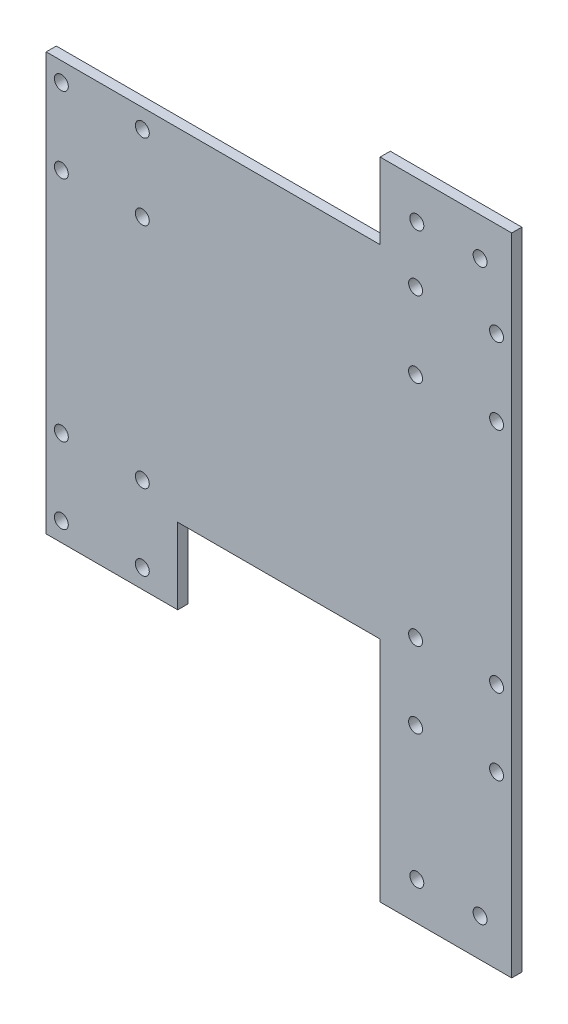
ISO-10303-21;
HEADER;
FILE_DESCRIPTION(('STEP AP214'),'2;1');
FILE_NAME('part.step','',(''),(''),'','','');
FILE_SCHEMA(('AUTOMOTIVE_DESIGN { 1 0 10303 214 1 1 1 1 }'));
ENDSEC;
DATA;
#1=APPLICATION_CONTEXT('core data for automotive mechanical design processes');
#2=APPLICATION_PROTOCOL_DEFINITION('international standard','automotive_design',2000,#1);
#3=PRODUCT_CONTEXT('',#1,'mechanical');
#4=PRODUCT('Part','Part','',(#3));
#5=PRODUCT_RELATED_PRODUCT_CATEGORY('part','',(#4));
#6=PRODUCT_DEFINITION_FORMATION('','',#4);
#7=PRODUCT_DEFINITION_CONTEXT('part definition',#1,'design');
#8=PRODUCT_DEFINITION('design','',#6,#7);
#9=PRODUCT_DEFINITION_SHAPE('','',#8);
#10=(LENGTH_UNIT() NAMED_UNIT(*) SI_UNIT(.MILLI.,.METRE.));
#11=(NAMED_UNIT(*) PLANE_ANGLE_UNIT() SI_UNIT($,.RADIAN.));
#12=(NAMED_UNIT(*) SI_UNIT($,.STERADIAN.) SOLID_ANGLE_UNIT());
#13=UNCERTAINTY_MEASURE_WITH_UNIT(LENGTH_MEASURE(1.E-05),#10,'distance_accuracy_value','');
#14=(GEOMETRIC_REPRESENTATION_CONTEXT(3) GLOBAL_UNCERTAINTY_ASSIGNED_CONTEXT((#13)) GLOBAL_UNIT_ASSIGNED_CONTEXT((#10,
#11,#12)) REPRESENTATION_CONTEXT('',''));
#15=CARTESIAN_POINT('',(0.,0.,0.));
#16=DIRECTION('',(0.,0.,1.));
#17=DIRECTION('',(1.,0.,0.));
#18=AXIS2_PLACEMENT_3D('',#15,#16,#17);
#19=CARTESIAN_POINT('',(0.,0.,4.));
#20=DIRECTION('',(0.,0.,-1.));
#21=DIRECTION('',(-1.,0.,0.));
#22=AXIS2_PLACEMENT_3D('',#19,#20,#21);
#23=PLANE('',#22);
#24=CARTESIAN_POINT('',(124.5,-67.5,4.));
#25=DIRECTION('',(0.,0.,1.));
#26=DIRECTION('',(1.,0.,0.));
#27=AXIS2_PLACEMENT_3D('',#24,#25,#26);
#28=CIRCLE('',#27,2.75);
#29=CARTESIAN_POINT('',(127.25,-67.5,4.));
#30=VERTEX_POINT('',#29);
#31=EDGE_CURVE('E337',#30,#30,#28,.T.);
#32=ORIENTED_EDGE('',*,*,#31,.F.);
#33=EDGE_LOOP('',(#32));
#34=FACE_BOUND('',#33,.T.);
#35=CARTESIAN_POINT('',(124.5,157.5,4.));
#36=DIRECTION('',(0.,0.,1.));
#37=DIRECTION('',(1.,0.,0.));
#38=AXIS2_PLACEMENT_3D('',#35,#36,#37);
#39=CIRCLE('',#38,2.75);
#40=CARTESIAN_POINT('',(127.25,157.5,4.));
#41=VERTEX_POINT('',#40);
#42=EDGE_CURVE('E329',#41,#41,#39,.T.);
#43=ORIENTED_EDGE('',*,*,#42,.F.);
#44=EDGE_LOOP('',(#43));
#45=FACE_BOUND('',#44,.T.);
#46=CARTESIAN_POINT('',(149.5,157.5,4.));
#47=DIRECTION('',(0.,0.,1.));
#48=DIRECTION('',(1.,0.,0.));
#49=AXIS2_PLACEMENT_3D('',#46,#47,#48);
#50=CIRCLE('',#49,2.75);
#51=CARTESIAN_POINT('',(152.25,157.5,4.));
#52=VERTEX_POINT('',#51);
#53=EDGE_CURVE('E321',#52,#52,#50,.T.);
#54=ORIENTED_EDGE('',*,*,#53,.F.);
#55=EDGE_LOOP('',(#54));
#56=FACE_BOUND('',#55,.T.);
#57=CARTESIAN_POINT('',(16.,-15.,4.));
#58=DIRECTION('',(0.,0.,-1.));
#59=DIRECTION('',(-1.,0.,0.));
#60=AXIS2_PLACEMENT_3D('',#57,#58,#59);
#61=CIRCLE('',#60,2.75);
#62=CARTESIAN_POINT('',(13.25,-15.,4.));
#63=VERTEX_POINT('',#62);
#64=EDGE_CURVE('E220',#63,#63,#61,.T.);
#65=ORIENTED_EDGE('',*,*,#64,.T.);
#66=EDGE_LOOP('',(#65));
#67=FACE_BOUND('',#66,.T.);
#68=CARTESIAN_POINT('',(16.,15.,4.));
#69=DIRECTION('',(0.,0.,-1.));
#70=DIRECTION('',(-1.,0.,0.));
#71=AXIS2_PLACEMENT_3D('',#68,#69,#70);
#72=CIRCLE('',#71,2.75);
#73=CARTESIAN_POINT('',(13.25,15.,4.));
#74=VERTEX_POINT('',#73);
#75=EDGE_CURVE('E226',#74,#74,#72,.T.);
#76=ORIENTED_EDGE('',*,*,#75,.T.);
#77=EDGE_LOOP('',(#76));
#78=FACE_BOUND('',#77,.T.);
#79=CARTESIAN_POINT('',(-16.,15.,4.));
#80=DIRECTION('',(0.,0.,-1.));
#81=DIRECTION('',(-1.,0.,0.));
#82=AXIS2_PLACEMENT_3D('',#79,#80,#81);
#83=CIRCLE('',#82,2.75);
#84=CARTESIAN_POINT('',(-18.75,15.,4.));
#85=VERTEX_POINT('',#84);
#86=EDGE_CURVE('E232',#85,#85,#83,.T.);
#87=ORIENTED_EDGE('',*,*,#86,.T.);
#88=EDGE_LOOP('',(#87));
#89=FACE_BOUND('',#88,.T.);
#90=CARTESIAN_POINT('',(-16.,-15.,4.));
#91=DIRECTION('',(0.,0.,-1.));
#92=DIRECTION('',(-1.,0.,0.));
#93=AXIS2_PLACEMENT_3D('',#90,#91,#92);
#94=CIRCLE('',#93,2.75);
#95=CARTESIAN_POINT('',(-18.75,-15.,4.));
#96=VERTEX_POINT('',#95);
#97=EDGE_CURVE('E238',#96,#96,#94,.T.);
#98=ORIENTED_EDGE('',*,*,#97,.T.);
#99=EDGE_LOOP('',(#98));
#100=FACE_BOUND('',#99,.T.);
#101=CARTESIAN_POINT('',(-16.,105.,4.));
#102=DIRECTION('',(0.,0.,-1.));
#103=DIRECTION('',(-1.,0.,0.));
#104=AXIS2_PLACEMENT_3D('',#101,#102,#103);
#105=CIRCLE('',#104,2.75);
#106=CARTESIAN_POINT('',(-18.75,105.,4.));
#107=VERTEX_POINT('',#106);
#108=EDGE_CURVE('E244',#107,#107,#105,.T.);
#109=ORIENTED_EDGE('',*,*,#108,.T.);
#110=EDGE_LOOP('',(#109));
#111=FACE_BOUND('',#110,.T.);
#112=CARTESIAN_POINT('',(16.,105.,4.));
#113=DIRECTION('',(0.,0.,-1.));
#114=DIRECTION('',(-1.,0.,0.));
#115=AXIS2_PLACEMENT_3D('',#112,#113,#114);
#116=CIRCLE('',#115,2.75);
#117=CARTESIAN_POINT('',(13.25,105.,4.));
#118=VERTEX_POINT('',#117);
#119=EDGE_CURVE('E250',#118,#118,#116,.T.);
#120=ORIENTED_EDGE('',*,*,#119,.T.);
#121=EDGE_LOOP('',(#120));
#122=FACE_BOUND('',#121,.T.);
#123=CARTESIAN_POINT('',(16.,135.,4.));
#124=DIRECTION('',(0.,0.,-1.));
#125=DIRECTION('',(-1.,0.,0.));
#126=AXIS2_PLACEMENT_3D('',#123,#124,#125);
#127=CIRCLE('',#126,2.75);
#128=CARTESIAN_POINT('',(13.25,135.,4.));
#129=VERTEX_POINT('',#128);
#130=EDGE_CURVE('E256',#129,#129,#127,.T.);
#131=ORIENTED_EDGE('',*,*,#130,.T.);
#132=EDGE_LOOP('',(#131));
#133=FACE_BOUND('',#132,.T.);
#134=CARTESIAN_POINT('',(-16.,135.,4.));
#135=DIRECTION('',(0.,0.,-1.));
#136=DIRECTION('',(-1.,0.,0.));
#137=AXIS2_PLACEMENT_3D('',#134,#135,#136);
#138=CIRCLE('',#137,2.75);
#139=CARTESIAN_POINT('',(-18.75,135.,4.));
#140=VERTEX_POINT('',#139);
#141=EDGE_CURVE('E262',#140,#140,#138,.T.);
#142=ORIENTED_EDGE('',*,*,#141,.T.);
#143=EDGE_LOOP('',(#142));
#144=FACE_BOUND('',#143,.T.);
#145=CARTESIAN_POINT('',(124.,135.,4.));
#146=DIRECTION('',(0.,0.,-1.));
#147=DIRECTION('',(-1.,0.,0.));
#148=AXIS2_PLACEMENT_3D('',#145,#146,#147);
#149=CIRCLE('',#148,2.75);
#150=CARTESIAN_POINT('',(121.25,135.,4.));
#151=VERTEX_POINT('',#150);
#152=EDGE_CURVE('E268',#151,#151,#149,.T.);
#153=ORIENTED_EDGE('',*,*,#152,.T.);
#154=EDGE_LOOP('',(#153));
#155=FACE_BOUND('',#154,.T.);
#156=CARTESIAN_POINT('',(124.,105.,4.));
#157=DIRECTION('',(0.,0.,-1.));
#158=DIRECTION('',(-1.,0.,0.));
#159=AXIS2_PLACEMENT_3D('',#156,#157,#158);
#160=CIRCLE('',#159,2.75);
#161=CARTESIAN_POINT('',(121.25,105.,4.));
#162=VERTEX_POINT('',#161);
#163=EDGE_CURVE('E274',#162,#162,#160,.T.);
#164=ORIENTED_EDGE('',*,*,#163,.T.);
#165=EDGE_LOOP('',(#164));
#166=FACE_BOUND('',#165,.T.);
#167=CARTESIAN_POINT('',(156.,105.,4.));
#168=DIRECTION('',(0.,0.,-1.));
#169=DIRECTION('',(-1.,0.,0.));
#170=AXIS2_PLACEMENT_3D('',#167,#168,#169);
#171=CIRCLE('',#170,2.75);
#172=CARTESIAN_POINT('',(153.25,105.,4.));
#173=VERTEX_POINT('',#172);
#174=EDGE_CURVE('E280',#173,#173,#171,.T.);
#175=ORIENTED_EDGE('',*,*,#174,.T.);
#176=EDGE_LOOP('',(#175));
#177=FACE_BOUND('',#176,.T.);
#178=CARTESIAN_POINT('',(156.,135.,4.));
#179=DIRECTION('',(0.,0.,-1.));
#180=DIRECTION('',(-1.,0.,0.));
#181=AXIS2_PLACEMENT_3D('',#178,#179,#180);
#182=CIRCLE('',#181,2.75);
#183=CARTESIAN_POINT('',(153.25,135.,4.));
#184=VERTEX_POINT('',#183);
#185=EDGE_CURVE('E286',#184,#184,#182,.T.);
#186=ORIENTED_EDGE('',*,*,#185,.T.);
#187=EDGE_LOOP('',(#186));
#188=FACE_BOUND('',#187,.T.);
#189=CARTESIAN_POINT('',(156.,15.,4.));
#190=DIRECTION('',(0.,0.,-1.));
#191=DIRECTION('',(-1.,0.,0.));
#192=AXIS2_PLACEMENT_3D('',#189,#190,#191);
#193=CIRCLE('',#192,2.75);
#194=CARTESIAN_POINT('',(153.25,15.,4.));
#195=VERTEX_POINT('',#194);
#196=EDGE_CURVE('E292',#195,#195,#193,.T.);
#197=ORIENTED_EDGE('',*,*,#196,.T.);
#198=EDGE_LOOP('',(#197));
#199=FACE_BOUND('',#198,.T.);
#200=CARTESIAN_POINT('',(124.,15.,4.));
#201=DIRECTION('',(0.,0.,-1.));
#202=DIRECTION('',(-1.,0.,0.));
#203=AXIS2_PLACEMENT_3D('',#200,#201,#202);
#204=CIRCLE('',#203,2.75);
#205=CARTESIAN_POINT('',(121.25,15.,4.));
#206=VERTEX_POINT('',#205);
#207=EDGE_CURVE('E298',#206,#206,#204,.T.);
#208=ORIENTED_EDGE('',*,*,#207,.T.);
#209=EDGE_LOOP('',(#208));
#210=FACE_BOUND('',#209,.T.);
#211=CARTESIAN_POINT('',(124.,-15.,4.));
#212=DIRECTION('',(0.,0.,-1.));
#213=DIRECTION('',(-1.,0.,0.));
#214=AXIS2_PLACEMENT_3D('',#211,#212,#213);
#215=CIRCLE('',#214,2.75);
#216=CARTESIAN_POINT('',(121.25,-15.,4.));
#217=VERTEX_POINT('',#216);
#218=EDGE_CURVE('E304',#217,#217,#215,.T.);
#219=ORIENTED_EDGE('',*,*,#218,.T.);
#220=EDGE_LOOP('',(#219));
#221=FACE_BOUND('',#220,.T.);
#222=CARTESIAN_POINT('',(156.,-15.,4.));
#223=DIRECTION('',(0.,0.,-1.));
#224=DIRECTION('',(-1.,0.,0.));
#225=AXIS2_PLACEMENT_3D('',#222,#223,#224);
#226=CIRCLE('',#225,2.75);
#227=CARTESIAN_POINT('',(153.25,-15.,4.));
#228=VERTEX_POINT('',#227);
#229=EDGE_CURVE('E164',#228,#228,#226,.T.);
#230=ORIENTED_EDGE('',*,*,#229,.T.);
#231=EDGE_LOOP('',(#230));
#232=FACE_BOUND('',#231,.T.);
#233=DIRECTION('',(1.,0.,0.));
#234=VECTOR('',#233,1.);
#235=CARTESIAN_POINT('',(-22.,-22.5,4.));
#236=LINE('',#235,#234);
#237=CARTESIAN_POINT('',(-22.,-22.5,4.));
#238=VERTEX_POINT('',#237);
#239=CARTESIAN_POINT('',(30.,-22.5,4.));
#240=VERTEX_POINT('',#239);
#241=EDGE_CURVE('E314',#238,#240,#236,.T.);
#242=ORIENTED_EDGE('',*,*,#241,.T.);
#243=DIRECTION('',(0.,-1.,0.));
#244=VECTOR('',#243,1.);
#245=CARTESIAN_POINT('',(30.,-22.5,4.));
#246=LINE('',#245,#244);
#247=CARTESIAN_POINT('',(30.,7.49999999999999,4.));
#248=VERTEX_POINT('',#247);
#249=EDGE_CURVE('E206',#248,#240,#246,.T.);
#250=ORIENTED_EDGE('',*,*,#249,.F.);
#251=DIRECTION('',(-1.,0.,0.));
#252=VECTOR('',#251,1.);
#253=CARTESIAN_POINT('',(30.,7.49999999999999,4.));
#254=LINE('',#253,#252);
#255=CARTESIAN_POINT('',(110.,7.49999999999999,4.));
#256=VERTEX_POINT('',#255);
#257=EDGE_CURVE('E210',#256,#248,#254,.T.);
#258=ORIENTED_EDGE('',*,*,#257,.F.);
#259=DIRECTION('',(0.,1.,0.));
#260=VECTOR('',#259,1.);
#261=CARTESIAN_POINT('',(110.,-22.5,4.));
#262=LINE('',#261,#260);
#263=CARTESIAN_POINT('',(110.,-82.5,4.));
#264=VERTEX_POINT('',#263);
#265=EDGE_CURVE('E192',#264,#256,#262,.T.);
#266=ORIENTED_EDGE('',*,*,#265,.F.);
#267=DIRECTION('',(1.,0.,0.));
#268=VECTOR('',#267,1.);
#269=CARTESIAN_POINT('',(162.,-82.5,4.));
#270=LINE('',#269,#268);
#271=CARTESIAN_POINT('',(162.,-82.5,4.));
#272=VERTEX_POINT('',#271);
#273=EDGE_CURVE('E195',#264,#272,#270,.T.);
#274=ORIENTED_EDGE('',*,*,#273,.T.);
#275=DIRECTION('',(0.,1.,0.));
#276=VECTOR('',#275,1.);
#277=CARTESIAN_POINT('',(162.,-22.5,4.));
#278=LINE('',#277,#276);
#279=CARTESIAN_POINT('',(162.,172.5,4.));
#280=VERTEX_POINT('',#279);
#281=EDGE_CURVE('E154',#272,#280,#278,.T.);
#282=ORIENTED_EDGE('',*,*,#281,.T.);
#283=DIRECTION('',(-1.,0.,0.));
#284=VECTOR('',#283,1.);
#285=CARTESIAN_POINT('',(162.,172.5,4.));
#286=LINE('',#285,#284);
#287=CARTESIAN_POINT('',(110.,172.5,4.));
#288=VERTEX_POINT('',#287);
#289=EDGE_CURVE('E138',#280,#288,#286,.T.);
#290=ORIENTED_EDGE('',*,*,#289,.T.);
#291=DIRECTION('',(0.,-1.,0.));
#292=VECTOR('',#291,1.);
#293=CARTESIAN_POINT('',(110.,142.5,4.));
#294=LINE('',#293,#292);
#295=CARTESIAN_POINT('',(110.,142.5,4.));
#296=VERTEX_POINT('',#295);
#297=EDGE_CURVE('E129',#288,#296,#294,.T.);
#298=ORIENTED_EDGE('',*,*,#297,.T.);
#299=DIRECTION('',(-1.,0.,0.));
#300=VECTOR('',#299,1.);
#301=CARTESIAN_POINT('',(-22.,142.5,4.));
#302=LINE('',#301,#300);
#303=CARTESIAN_POINT('',(-22.,142.5,4.));
#304=VERTEX_POINT('',#303);
#305=EDGE_CURVE('E147',#296,#304,#302,.T.);
#306=ORIENTED_EDGE('',*,*,#305,.T.);
#307=DIRECTION('',(0.,-1.,0.));
#308=VECTOR('',#307,1.);
#309=CARTESIAN_POINT('',(-22.,-22.5,4.));
#310=LINE('',#309,#308);
#311=EDGE_CURVE('E312',#304,#238,#310,.T.);
#312=ORIENTED_EDGE('',*,*,#311,.T.);
#313=EDGE_LOOP('',(#242,#250,#258,#266,#274,#282,#290,#298,#306,#312));
#314=FACE_BOUND('',#313,.T.);
#315=CARTESIAN_POINT('',(149.5,-67.5,4.));
#316=DIRECTION('',(0.,0.,1.));
#317=DIRECTION('',(1.,0.,0.));
#318=AXIS2_PLACEMENT_3D('',#315,#316,#317);
#319=CIRCLE('',#318,2.75);
#320=CARTESIAN_POINT('',(152.25,-67.5,4.));
#321=VERTEX_POINT('',#320);
#322=EDGE_CURVE('E343',#321,#321,#319,.T.);
#323=ORIENTED_EDGE('',*,*,#322,.F.);
#324=EDGE_LOOP('',(#323));
#325=FACE_BOUND('',#324,.T.);
#326=ADVANCED_FACE('F35',(#34,#45,#56,#67,#78,#89,#100,#111,#122,#133,#144,#155,#166,#177,#188,
#199,#210,#221,#232,#314,#325),#23,.F.);
#327=CARTESIAN_POINT('',(-22.,142.5,4.));
#328=DIRECTION('',(0.,-1.,0.));
#329=DIRECTION('',(0.,0.,-1.));
#330=AXIS2_PLACEMENT_3D('',#327,#328,#329);
#331=PLANE('',#330);
#332=DIRECTION('',(0.,0.,1.));
#333=VECTOR('',#332,1.);
#334=CARTESIAN_POINT('',(110.,142.5,-79.3977329651168));
#335=LINE('',#334,#333);
#336=CARTESIAN_POINT('',(110.,142.5,0.));
#337=VERTEX_POINT('',#336);
#338=EDGE_CURVE('E52',#337,#296,#335,.T.);
#339=ORIENTED_EDGE('',*,*,#338,.F.);
#340=DIRECTION('',(-1.,0.,0.));
#341=VECTOR('',#340,1.);
#342=CARTESIAN_POINT('',(-22.,142.5,0.));
#343=LINE('',#342,#341);
#344=CARTESIAN_POINT('',(-22.,142.5,0.));
#345=VERTEX_POINT('',#344);
#346=EDGE_CURVE('E122',#337,#345,#343,.T.);
#347=ORIENTED_EDGE('',*,*,#346,.T.);
#348=DIRECTION('',(0.,0.,-1.));
#349=VECTOR('',#348,1.);
#350=CARTESIAN_POINT('',(-22.,142.5,4.));
#351=LINE('',#350,#349);
#352=EDGE_CURVE('E153',#304,#345,#351,.T.);
#353=ORIENTED_EDGE('',*,*,#352,.F.);
#354=ORIENTED_EDGE('',*,*,#305,.F.);
#355=EDGE_LOOP('',(#339,#347,#353,#354));
#356=FACE_BOUND('',#355,.T.);
#357=ADVANCED_FACE('F349',(#356),#331,.F.);
#358=CARTESIAN_POINT('',(-22.,-22.5,4.));
#359=DIRECTION('',(0.,1.,0.));
#360=DIRECTION('',(0.,0.,1.));
#361=AXIS2_PLACEMENT_3D('',#358,#359,#360);
#362=PLANE('',#361);
#363=DIRECTION('',(1.,0.,0.));
#364=VECTOR('',#363,1.);
#365=CARTESIAN_POINT('',(-22.,-22.5,0.));
#366=LINE('',#365,#364);
#367=CARTESIAN_POINT('',(-22.,-22.5,0.));
#368=VERTEX_POINT('',#367);
#369=CARTESIAN_POINT('',(30.,-22.5,0.));
#370=VERTEX_POINT('',#369);
#371=EDGE_CURVE('E163',#368,#370,#366,.T.);
#372=ORIENTED_EDGE('',*,*,#371,.T.);
#373=DIRECTION('',(0.,0.,1.));
#374=VECTOR('',#373,1.);
#375=CARTESIAN_POINT('',(30.,-22.5,-6.));
#376=LINE('',#375,#374);
#377=EDGE_CURVE('E212',#370,#240,#376,.T.);
#378=ORIENTED_EDGE('',*,*,#377,.T.);
#379=ORIENTED_EDGE('',*,*,#241,.F.);
#380=DIRECTION('',(0.,0.,-1.));
#381=VECTOR('',#380,1.);
#382=CARTESIAN_POINT('',(-22.,-22.5,4.));
#383=LINE('',#382,#381);
#384=EDGE_CURVE('E172',#238,#368,#383,.T.);
#385=ORIENTED_EDGE('',*,*,#384,.T.);
#386=EDGE_LOOP('',(#372,#378,#379,#385));
#387=FACE_BOUND('',#386,.T.);
#388=ADVANCED_FACE('F355',(#387),#362,.F.);
#389=CARTESIAN_POINT('',(-22.,-22.5,4.));
#390=DIRECTION('',(1.,0.,0.));
#391=DIRECTION('',(0.,1.,0.));
#392=AXIS2_PLACEMENT_3D('',#389,#390,#391);
#393=PLANE('',#392);
#394=DIRECTION('',(0.,-1.,0.));
#395=VECTOR('',#394,1.);
#396=CARTESIAN_POINT('',(-22.,-22.5,0.));
#397=LINE('',#396,#395);
#398=EDGE_CURVE('E160',#345,#368,#397,.T.);
#399=ORIENTED_EDGE('',*,*,#398,.T.);
#400=ORIENTED_EDGE('',*,*,#384,.F.);
#401=ORIENTED_EDGE('',*,*,#311,.F.);
#402=ORIENTED_EDGE('',*,*,#352,.T.);
#403=EDGE_LOOP('',(#399,#400,#401,#402));
#404=FACE_BOUND('',#403,.T.);
#405=ADVANCED_FACE('F37',(#404),#393,.F.);
#406=CARTESIAN_POINT('',(162.,-22.5,4.));
#407=DIRECTION('',(-1.,0.,0.));
#408=DIRECTION('',(0.,0.,1.));
#409=AXIS2_PLACEMENT_3D('',#406,#407,#408);
#410=PLANE('',#409);
#411=DIRECTION('',(0.,1.,0.));
#412=VECTOR('',#411,1.);
#413=CARTESIAN_POINT('',(162.,-22.5,0.));
#414=LINE('',#413,#412);
#415=CARTESIAN_POINT('',(162.,-82.5,0.));
#416=VERTEX_POINT('',#415);
#417=CARTESIAN_POINT('',(162.,172.5,0.));
#418=VERTEX_POINT('',#417);
#419=EDGE_CURVE('E167',#416,#418,#414,.T.);
#420=ORIENTED_EDGE('',*,*,#419,.T.);
#421=DIRECTION('',(0.,0.,1.));
#422=VECTOR('',#421,1.);
#423=CARTESIAN_POINT('',(162.,172.5,-79.3977329651168));
#424=LINE('',#423,#422);
#425=EDGE_CURVE('E136',#418,#280,#424,.T.);
#426=ORIENTED_EDGE('',*,*,#425,.T.);
#427=ORIENTED_EDGE('',*,*,#281,.F.);
#428=DIRECTION('',(0.,0.,1.));
#429=VECTOR('',#428,1.);
#430=CARTESIAN_POINT('',(162.,-82.5,-79.3977329651168));
#431=LINE('',#430,#429);
#432=EDGE_CURVE('E201',#416,#272,#431,.T.);
#433=ORIENTED_EDGE('',*,*,#432,.F.);
#434=EDGE_LOOP('',(#420,#426,#427,#433));
#435=FACE_BOUND('',#434,.T.);
#436=ADVANCED_FACE('F319',(#435),#410,.F.);
#437=CARTESIAN_POINT('',(0.,0.,0.));
#438=DIRECTION('',(0.,0.,-1.));
#439=DIRECTION('',(-1.,0.,0.));
#440=AXIS2_PLACEMENT_3D('',#437,#438,#439);
#441=PLANE('',#440);
#442=CARTESIAN_POINT('',(149.5,-67.5,0.));
#443=DIRECTION('',(0.,0.,-1.));
#444=DIRECTION('',(-1.,0.,0.));
#445=AXIS2_PLACEMENT_3D('',#442,#443,#444);
#446=CIRCLE('',#445,2.75);
#447=CARTESIAN_POINT('',(146.75,-67.5,0.));
#448=VERTEX_POINT('',#447);
#449=EDGE_CURVE('E340',#448,#448,#446,.T.);
#450=ORIENTED_EDGE('',*,*,#449,.F.);
#451=EDGE_LOOP('',(#450));
#452=FACE_BOUND('',#451,.T.);
#453=CARTESIAN_POINT('',(124.5,-67.5,0.));
#454=DIRECTION('',(0.,0.,-1.));
#455=DIRECTION('',(-1.,0.,0.));
#456=AXIS2_PLACEMENT_3D('',#453,#454,#455);
#457=CIRCLE('',#456,2.75);
#458=CARTESIAN_POINT('',(121.75,-67.5,0.));
#459=VERTEX_POINT('',#458);
#460=EDGE_CURVE('E334',#459,#459,#457,.T.);
#461=ORIENTED_EDGE('',*,*,#460,.F.);
#462=EDGE_LOOP('',(#461));
#463=FACE_BOUND('',#462,.T.);
#464=CARTESIAN_POINT('',(124.5,157.5,0.));
#465=DIRECTION('',(0.,0.,-1.));
#466=DIRECTION('',(-1.,0.,0.));
#467=AXIS2_PLACEMENT_3D('',#464,#465,#466);
#468=CIRCLE('',#467,2.75);
#469=CARTESIAN_POINT('',(121.75,157.5,0.));
#470=VERTEX_POINT('',#469);
#471=EDGE_CURVE('E325',#470,#470,#468,.T.);
#472=ORIENTED_EDGE('',*,*,#471,.F.);
#473=EDGE_LOOP('',(#472));
#474=FACE_BOUND('',#473,.T.);
#475=CARTESIAN_POINT('',(149.5,157.5,0.));
#476=DIRECTION('',(0.,0.,-1.));
#477=DIRECTION('',(-1.,0.,0.));
#478=AXIS2_PLACEMENT_3D('',#475,#476,#477);
#479=CIRCLE('',#478,2.75);
#480=CARTESIAN_POINT('',(146.75,157.5,0.));
#481=VERTEX_POINT('',#480);
#482=EDGE_CURVE('E39',#481,#481,#479,.T.);
#483=ORIENTED_EDGE('',*,*,#482,.F.);
#484=EDGE_LOOP('',(#483));
#485=FACE_BOUND('',#484,.T.);
#486=DIRECTION('',(0.,1.,0.));
#487=VECTOR('',#486,1.);
#488=CARTESIAN_POINT('',(30.,0.,0.));
#489=LINE('',#488,#487);
#490=CARTESIAN_POINT('',(30.,7.49999999999999,0.));
#491=VERTEX_POINT('',#490);
#492=EDGE_CURVE('E11',#370,#491,#489,.T.);
#493=ORIENTED_EDGE('',*,*,#492,.F.);
#494=ORIENTED_EDGE('',*,*,#371,.F.);
#495=ORIENTED_EDGE('',*,*,#398,.F.);
#496=ORIENTED_EDGE('',*,*,#346,.F.);
#497=DIRECTION('',(0.,-1.,0.));
#498=VECTOR('',#497,1.);
#499=CARTESIAN_POINT('',(110.,142.5,0.));
#500=LINE('',#499,#498);
#501=CARTESIAN_POINT('',(110.,172.5,0.));
#502=VERTEX_POINT('',#501);
#503=EDGE_CURVE('E113',#502,#337,#500,.T.);
#504=ORIENTED_EDGE('',*,*,#503,.F.);
#505=DIRECTION('',(-1.,0.,0.));
#506=VECTOR('',#505,1.);
#507=CARTESIAN_POINT('',(162.,172.5,0.));
#508=LINE('',#507,#506);
#509=EDGE_CURVE('E119',#418,#502,#508,.T.);
#510=ORIENTED_EDGE('',*,*,#509,.F.);
#511=ORIENTED_EDGE('',*,*,#419,.F.);
#512=DIRECTION('',(1.,0.,0.));
#513=VECTOR('',#512,1.);
#514=CARTESIAN_POINT('',(162.,-82.5,0.));
#515=LINE('',#514,#513);
#516=CARTESIAN_POINT('',(110.,-82.5,0.));
#517=VERTEX_POINT('',#516);
#518=EDGE_CURVE('E186',#517,#416,#515,.T.);
#519=ORIENTED_EDGE('',*,*,#518,.F.);
#520=DIRECTION('',(0.,-1.,0.));
#521=VECTOR('',#520,1.);
#522=CARTESIAN_POINT('',(110.,0.,0.));
#523=LINE('',#522,#521);
#524=CARTESIAN_POINT('',(110.,7.49999999999999,0.));
#525=VERTEX_POINT('',#524);
#526=EDGE_CURVE('E175',#525,#517,#523,.T.);
#527=ORIENTED_EDGE('',*,*,#526,.F.);
#528=DIRECTION('',(1.,0.,0.));
#529=VECTOR('',#528,1.);
#530=CARTESIAN_POINT('',(0.,7.49999999999999,0.));
#531=LINE('',#530,#529);
#532=EDGE_CURVE('E44',#491,#525,#531,.T.);
#533=ORIENTED_EDGE('',*,*,#532,.F.);
#534=EDGE_LOOP('',(#493,#494,#495,#496,#504,#510,#511,#519,#527,#533));
#535=FACE_BOUND('',#534,.T.);
#536=CARTESIAN_POINT('',(16.,-15.,0.));
#537=DIRECTION('',(0.,0.,-1.));
#538=DIRECTION('',(-1.,0.,0.));
#539=AXIS2_PLACEMENT_3D('',#536,#537,#538);
#540=CIRCLE('',#539,2.74999999999999);
#541=CARTESIAN_POINT('',(13.25,-15.,0.));
#542=VERTEX_POINT('',#541);
#543=EDGE_CURVE('E214',#542,#542,#540,.T.);
#544=ORIENTED_EDGE('',*,*,#543,.F.);
#545=EDGE_LOOP('',(#544));
#546=FACE_BOUND('',#545,.T.);
#547=CARTESIAN_POINT('',(16.,15.,0.));
#548=DIRECTION('',(0.,0.,-1.));
#549=DIRECTION('',(-1.,0.,0.));
#550=AXIS2_PLACEMENT_3D('',#547,#548,#549);
#551=CIRCLE('',#550,2.74999999999999);
#552=CARTESIAN_POINT('',(13.25,15.,0.));
#553=VERTEX_POINT('',#552);
#554=EDGE_CURVE('E223',#553,#553,#551,.T.);
#555=ORIENTED_EDGE('',*,*,#554,.F.);
#556=EDGE_LOOP('',(#555));
#557=FACE_BOUND('',#556,.T.);
#558=CARTESIAN_POINT('',(-16.,15.,0.));
#559=DIRECTION('',(0.,0.,-1.));
#560=DIRECTION('',(-1.,0.,0.));
#561=AXIS2_PLACEMENT_3D('',#558,#559,#560);
#562=CIRCLE('',#561,2.74999999999999);
#563=CARTESIAN_POINT('',(-18.75,15.,0.));
#564=VERTEX_POINT('',#563);
#565=EDGE_CURVE('E229',#564,#564,#562,.T.);
#566=ORIENTED_EDGE('',*,*,#565,.F.);
#567=EDGE_LOOP('',(#566));
#568=FACE_BOUND('',#567,.T.);
#569=CARTESIAN_POINT('',(-16.,-15.,0.));
#570=DIRECTION('',(0.,0.,-1.));
#571=DIRECTION('',(-1.,0.,0.));
#572=AXIS2_PLACEMENT_3D('',#569,#570,#571);
#573=CIRCLE('',#572,2.74999999999999);
#574=CARTESIAN_POINT('',(-18.75,-15.,0.));
#575=VERTEX_POINT('',#574);
#576=EDGE_CURVE('E235',#575,#575,#573,.T.);
#577=ORIENTED_EDGE('',*,*,#576,.F.);
#578=EDGE_LOOP('',(#577));
#579=FACE_BOUND('',#578,.T.);
#580=CARTESIAN_POINT('',(-16.,105.,0.));
#581=DIRECTION('',(0.,0.,-1.));
#582=DIRECTION('',(-1.,0.,0.));
#583=AXIS2_PLACEMENT_3D('',#580,#581,#582);
#584=CIRCLE('',#583,2.74999999999999);
#585=CARTESIAN_POINT('',(-18.75,105.,0.));
#586=VERTEX_POINT('',#585);
#587=EDGE_CURVE('E241',#586,#586,#584,.T.);
#588=ORIENTED_EDGE('',*,*,#587,.F.);
#589=EDGE_LOOP('',(#588));
#590=FACE_BOUND('',#589,.T.);
#591=CARTESIAN_POINT('',(16.,105.,0.));
#592=DIRECTION('',(0.,0.,-1.));
#593=DIRECTION('',(-1.,0.,0.));
#594=AXIS2_PLACEMENT_3D('',#591,#592,#593);
#595=CIRCLE('',#594,2.74999999999999);
#596=CARTESIAN_POINT('',(13.25,105.,0.));
#597=VERTEX_POINT('',#596);
#598=EDGE_CURVE('E247',#597,#597,#595,.T.);
#599=ORIENTED_EDGE('',*,*,#598,.F.);
#600=EDGE_LOOP('',(#599));
#601=FACE_BOUND('',#600,.T.);
#602=CARTESIAN_POINT('',(16.,135.,0.));
#603=DIRECTION('',(0.,0.,-1.));
#604=DIRECTION('',(-1.,0.,0.));
#605=AXIS2_PLACEMENT_3D('',#602,#603,#604);
#606=CIRCLE('',#605,2.74999999999999);
#607=CARTESIAN_POINT('',(13.25,135.,0.));
#608=VERTEX_POINT('',#607);
#609=EDGE_CURVE('E253',#608,#608,#606,.T.);
#610=ORIENTED_EDGE('',*,*,#609,.F.);
#611=EDGE_LOOP('',(#610));
#612=FACE_BOUND('',#611,.T.);
#613=CARTESIAN_POINT('',(-16.,135.,0.));
#614=DIRECTION('',(0.,0.,-1.));
#615=DIRECTION('',(-1.,0.,0.));
#616=AXIS2_PLACEMENT_3D('',#613,#614,#615);
#617=CIRCLE('',#616,2.74999999999999);
#618=CARTESIAN_POINT('',(-18.75,135.,0.));
#619=VERTEX_POINT('',#618);
#620=EDGE_CURVE('E259',#619,#619,#617,.T.);
#621=ORIENTED_EDGE('',*,*,#620,.F.);
#622=EDGE_LOOP('',(#621));
#623=FACE_BOUND('',#622,.T.);
#624=CARTESIAN_POINT('',(124.,135.,0.));
#625=DIRECTION('',(0.,0.,-1.));
#626=DIRECTION('',(-1.,0.,0.));
#627=AXIS2_PLACEMENT_3D('',#624,#625,#626);
#628=CIRCLE('',#627,2.75);
#629=CARTESIAN_POINT('',(121.25,135.,0.));
#630=VERTEX_POINT('',#629);
#631=EDGE_CURVE('E265',#630,#630,#628,.T.);
#632=ORIENTED_EDGE('',*,*,#631,.F.);
#633=EDGE_LOOP('',(#632));
#634=FACE_BOUND('',#633,.T.);
#635=CARTESIAN_POINT('',(124.,105.,0.));
#636=DIRECTION('',(0.,0.,-1.));
#637=DIRECTION('',(-1.,0.,0.));
#638=AXIS2_PLACEMENT_3D('',#635,#636,#637);
#639=CIRCLE('',#638,2.75);
#640=CARTESIAN_POINT('',(121.25,105.,0.));
#641=VERTEX_POINT('',#640);
#642=EDGE_CURVE('E271',#641,#641,#639,.T.);
#643=ORIENTED_EDGE('',*,*,#642,.F.);
#644=EDGE_LOOP('',(#643));
#645=FACE_BOUND('',#644,.T.);
#646=CARTESIAN_POINT('',(156.,105.,0.));
#647=DIRECTION('',(0.,0.,-1.));
#648=DIRECTION('',(-1.,0.,0.));
#649=AXIS2_PLACEMENT_3D('',#646,#647,#648);
#650=CIRCLE('',#649,2.74999999999997);
#651=CARTESIAN_POINT('',(153.25,105.,0.));
#652=VERTEX_POINT('',#651);
#653=EDGE_CURVE('E277',#652,#652,#650,.T.);
#654=ORIENTED_EDGE('',*,*,#653,.F.);
#655=EDGE_LOOP('',(#654));
#656=FACE_BOUND('',#655,.T.);
#657=CARTESIAN_POINT('',(156.,135.,0.));
#658=DIRECTION('',(0.,0.,-1.));
#659=DIRECTION('',(-1.,0.,0.));
#660=AXIS2_PLACEMENT_3D('',#657,#658,#659);
#661=CIRCLE('',#660,2.74999999999997);
#662=CARTESIAN_POINT('',(153.25,135.,0.));
#663=VERTEX_POINT('',#662);
#664=EDGE_CURVE('E283',#663,#663,#661,.T.);
#665=ORIENTED_EDGE('',*,*,#664,.F.);
#666=EDGE_LOOP('',(#665));
#667=FACE_BOUND('',#666,.T.);
#668=CARTESIAN_POINT('',(156.,15.,0.));
#669=DIRECTION('',(0.,0.,-1.));
#670=DIRECTION('',(-1.,0.,0.));
#671=AXIS2_PLACEMENT_3D('',#668,#669,#670);
#672=CIRCLE('',#671,2.74999999999997);
#673=CARTESIAN_POINT('',(153.25,15.,0.));
#674=VERTEX_POINT('',#673);
#675=EDGE_CURVE('E289',#674,#674,#672,.T.);
#676=ORIENTED_EDGE('',*,*,#675,.F.);
#677=EDGE_LOOP('',(#676));
#678=FACE_BOUND('',#677,.T.);
#679=CARTESIAN_POINT('',(124.,15.,0.));
#680=DIRECTION('',(0.,0.,-1.));
#681=DIRECTION('',(-1.,0.,0.));
#682=AXIS2_PLACEMENT_3D('',#679,#680,#681);
#683=CIRCLE('',#682,2.75);
#684=CARTESIAN_POINT('',(121.25,15.,0.));
#685=VERTEX_POINT('',#684);
#686=EDGE_CURVE('E295',#685,#685,#683,.T.);
#687=ORIENTED_EDGE('',*,*,#686,.F.);
#688=EDGE_LOOP('',(#687));
#689=FACE_BOUND('',#688,.T.);
#690=CARTESIAN_POINT('',(124.,-15.,0.));
#691=DIRECTION('',(0.,0.,-1.));
#692=DIRECTION('',(-1.,0.,0.));
#693=AXIS2_PLACEMENT_3D('',#690,#691,#692);
#694=CIRCLE('',#693,2.75);
#695=CARTESIAN_POINT('',(121.25,-15.,0.));
#696=VERTEX_POINT('',#695);
#697=EDGE_CURVE('E301',#696,#696,#694,.T.);
#698=ORIENTED_EDGE('',*,*,#697,.F.);
#699=EDGE_LOOP('',(#698));
#700=FACE_BOUND('',#699,.T.);
#701=CARTESIAN_POINT('',(156.,-15.,0.));
#702=DIRECTION('',(0.,0.,-1.));
#703=DIRECTION('',(-1.,0.,0.));
#704=AXIS2_PLACEMENT_3D('',#701,#702,#703);
#705=CIRCLE('',#704,2.74999999999997);
#706=CARTESIAN_POINT('',(153.25,-15.,0.));
#707=VERTEX_POINT('',#706);
#708=EDGE_CURVE('E307',#707,#707,#705,.T.);
#709=ORIENTED_EDGE('',*,*,#708,.F.);
#710=EDGE_LOOP('',(#709));
#711=FACE_BOUND('',#710,.T.);
#712=ADVANCED_FACE('F116',(#452,#463,#474,#485,#535,#546,#557,#568,#579,#590,#601,#612,#623,
#634,#645,#656,#667,#678,#689,#700,#711),#441,.T.);
#713=CARTESIAN_POINT('',(156.,-15.,0.));
#714=DIRECTION('',(0.,0.,-1.));
#715=DIRECTION('',(-1.,0.,0.));
#716=AXIS2_PLACEMENT_3D('',#713,#714,#715);
#717=CYLINDRICAL_SURFACE('',#716,2.74999999999999);
#718=ORIENTED_EDGE('',*,*,#229,.F.);
#719=EDGE_LOOP('',(#718));
#720=FACE_BOUND('',#719,.T.);
#721=ORIENTED_EDGE('',*,*,#708,.T.);
#722=EDGE_LOOP('',(#721));
#723=FACE_BOUND('',#722,.T.);
#724=ADVANCED_FACE('F361',(#720,#723),#717,.F.);
#725=CARTESIAN_POINT('',(124.,-15.,0.));
#726=DIRECTION('',(0.,0.,-1.));
#727=DIRECTION('',(-1.,0.,0.));
#728=AXIS2_PLACEMENT_3D('',#725,#726,#727);
#729=CYLINDRICAL_SURFACE('',#728,2.75);
#730=ORIENTED_EDGE('',*,*,#218,.F.);
#731=EDGE_LOOP('',(#730));
#732=FACE_BOUND('',#731,.T.);
#733=ORIENTED_EDGE('',*,*,#697,.T.);
#734=EDGE_LOOP('',(#733));
#735=FACE_BOUND('',#734,.T.);
#736=ADVANCED_FACE('F438',(#732,#735),#729,.F.);
#737=CARTESIAN_POINT('',(124.,15.,0.));
#738=DIRECTION('',(0.,0.,-1.));
#739=DIRECTION('',(-1.,0.,0.));
#740=AXIS2_PLACEMENT_3D('',#737,#738,#739);
#741=CYLINDRICAL_SURFACE('',#740,2.75);
#742=ORIENTED_EDGE('',*,*,#207,.F.);
#743=EDGE_LOOP('',(#742));
#744=FACE_BOUND('',#743,.T.);
#745=ORIENTED_EDGE('',*,*,#686,.T.);
#746=EDGE_LOOP('',(#745));
#747=FACE_BOUND('',#746,.T.);
#748=ADVANCED_FACE('F435',(#744,#747),#741,.F.);
#749=CARTESIAN_POINT('',(156.,15.,0.));
#750=DIRECTION('',(0.,0.,-1.));
#751=DIRECTION('',(-1.,0.,0.));
#752=AXIS2_PLACEMENT_3D('',#749,#750,#751);
#753=CYLINDRICAL_SURFACE('',#752,2.74999999999999);
#754=ORIENTED_EDGE('',*,*,#196,.F.);
#755=EDGE_LOOP('',(#754));
#756=FACE_BOUND('',#755,.T.);
#757=ORIENTED_EDGE('',*,*,#675,.T.);
#758=EDGE_LOOP('',(#757));
#759=FACE_BOUND('',#758,.T.);
#760=ADVANCED_FACE('F431',(#756,#759),#753,.F.);
#761=CARTESIAN_POINT('',(156.,135.,0.));
#762=DIRECTION('',(0.,0.,-1.));
#763=DIRECTION('',(-1.,0.,0.));
#764=AXIS2_PLACEMENT_3D('',#761,#762,#763);
#765=CYLINDRICAL_SURFACE('',#764,2.74999999999999);
#766=ORIENTED_EDGE('',*,*,#185,.F.);
#767=EDGE_LOOP('',(#766));
#768=FACE_BOUND('',#767,.T.);
#769=ORIENTED_EDGE('',*,*,#664,.T.);
#770=EDGE_LOOP('',(#769));
#771=FACE_BOUND('',#770,.T.);
#772=ADVANCED_FACE('F427',(#768,#771),#765,.F.);
#773=CARTESIAN_POINT('',(156.,105.,0.));
#774=DIRECTION('',(0.,0.,-1.));
#775=DIRECTION('',(-1.,0.,0.));
#776=AXIS2_PLACEMENT_3D('',#773,#774,#775);
#777=CYLINDRICAL_SURFACE('',#776,2.74999999999999);
#778=ORIENTED_EDGE('',*,*,#174,.F.);
#779=EDGE_LOOP('',(#778));
#780=FACE_BOUND('',#779,.T.);
#781=ORIENTED_EDGE('',*,*,#653,.T.);
#782=EDGE_LOOP('',(#781));
#783=FACE_BOUND('',#782,.T.);
#784=ADVANCED_FACE('F423',(#780,#783),#777,.F.);
#785=CARTESIAN_POINT('',(124.,105.,0.));
#786=DIRECTION('',(0.,0.,-1.));
#787=DIRECTION('',(-1.,0.,0.));
#788=AXIS2_PLACEMENT_3D('',#785,#786,#787);
#789=CYLINDRICAL_SURFACE('',#788,2.75);
#790=ORIENTED_EDGE('',*,*,#163,.F.);
#791=EDGE_LOOP('',(#790));
#792=FACE_BOUND('',#791,.T.);
#793=ORIENTED_EDGE('',*,*,#642,.T.);
#794=EDGE_LOOP('',(#793));
#795=FACE_BOUND('',#794,.T.);
#796=ADVANCED_FACE('F419',(#792,#795),#789,.F.);
#797=CARTESIAN_POINT('',(124.,135.,0.));
#798=DIRECTION('',(0.,0.,-1.));
#799=DIRECTION('',(-1.,0.,0.));
#800=AXIS2_PLACEMENT_3D('',#797,#798,#799);
#801=CYLINDRICAL_SURFACE('',#800,2.75);
#802=ORIENTED_EDGE('',*,*,#152,.F.);
#803=EDGE_LOOP('',(#802));
#804=FACE_BOUND('',#803,.T.);
#805=ORIENTED_EDGE('',*,*,#631,.T.);
#806=EDGE_LOOP('',(#805));
#807=FACE_BOUND('',#806,.T.);
#808=ADVANCED_FACE('F415',(#804,#807),#801,.F.);
#809=CARTESIAN_POINT('',(-16.,135.,0.));
#810=DIRECTION('',(0.,0.,-1.));
#811=DIRECTION('',(-1.,0.,0.));
#812=AXIS2_PLACEMENT_3D('',#809,#810,#811);
#813=CYLINDRICAL_SURFACE('',#812,2.74999999999999);
#814=ORIENTED_EDGE('',*,*,#141,.F.);
#815=EDGE_LOOP('',(#814));
#816=FACE_BOUND('',#815,.T.);
#817=ORIENTED_EDGE('',*,*,#620,.T.);
#818=EDGE_LOOP('',(#817));
#819=FACE_BOUND('',#818,.T.);
#820=ADVANCED_FACE('F411',(#816,#819),#813,.F.);
#821=CARTESIAN_POINT('',(16.,135.,0.));
#822=DIRECTION('',(0.,0.,-1.));
#823=DIRECTION('',(-1.,0.,0.));
#824=AXIS2_PLACEMENT_3D('',#821,#822,#823);
#825=CYLINDRICAL_SURFACE('',#824,2.74999999999999);
#826=ORIENTED_EDGE('',*,*,#130,.F.);
#827=EDGE_LOOP('',(#826));
#828=FACE_BOUND('',#827,.T.);
#829=ORIENTED_EDGE('',*,*,#609,.T.);
#830=EDGE_LOOP('',(#829));
#831=FACE_BOUND('',#830,.T.);
#832=ADVANCED_FACE('F407',(#828,#831),#825,.F.);
#833=CARTESIAN_POINT('',(16.,105.,0.));
#834=DIRECTION('',(0.,0.,-1.));
#835=DIRECTION('',(-1.,0.,0.));
#836=AXIS2_PLACEMENT_3D('',#833,#834,#835);
#837=CYLINDRICAL_SURFACE('',#836,2.74999999999999);
#838=ORIENTED_EDGE('',*,*,#119,.F.);
#839=EDGE_LOOP('',(#838));
#840=FACE_BOUND('',#839,.T.);
#841=ORIENTED_EDGE('',*,*,#598,.T.);
#842=EDGE_LOOP('',(#841));
#843=FACE_BOUND('',#842,.T.);
#844=ADVANCED_FACE('F403',(#840,#843),#837,.F.);
#845=CARTESIAN_POINT('',(-16.,105.,0.));
#846=DIRECTION('',(0.,0.,-1.));
#847=DIRECTION('',(-1.,0.,0.));
#848=AXIS2_PLACEMENT_3D('',#845,#846,#847);
#849=CYLINDRICAL_SURFACE('',#848,2.74999999999999);
#850=ORIENTED_EDGE('',*,*,#108,.F.);
#851=EDGE_LOOP('',(#850));
#852=FACE_BOUND('',#851,.T.);
#853=ORIENTED_EDGE('',*,*,#587,.T.);
#854=EDGE_LOOP('',(#853));
#855=FACE_BOUND('',#854,.T.);
#856=ADVANCED_FACE('F399',(#852,#855),#849,.F.);
#857=CARTESIAN_POINT('',(-16.,-15.,0.));
#858=DIRECTION('',(0.,0.,-1.));
#859=DIRECTION('',(-1.,0.,0.));
#860=AXIS2_PLACEMENT_3D('',#857,#858,#859);
#861=CYLINDRICAL_SURFACE('',#860,2.74999999999999);
#862=ORIENTED_EDGE('',*,*,#97,.F.);
#863=EDGE_LOOP('',(#862));
#864=FACE_BOUND('',#863,.T.);
#865=ORIENTED_EDGE('',*,*,#576,.T.);
#866=EDGE_LOOP('',(#865));
#867=FACE_BOUND('',#866,.T.);
#868=ADVANCED_FACE('F395',(#864,#867),#861,.F.);
#869=CARTESIAN_POINT('',(-16.,15.,0.));
#870=DIRECTION('',(0.,0.,-1.));
#871=DIRECTION('',(-1.,0.,0.));
#872=AXIS2_PLACEMENT_3D('',#869,#870,#871);
#873=CYLINDRICAL_SURFACE('',#872,2.74999999999999);
#874=ORIENTED_EDGE('',*,*,#86,.F.);
#875=EDGE_LOOP('',(#874));
#876=FACE_BOUND('',#875,.T.);
#877=ORIENTED_EDGE('',*,*,#565,.T.);
#878=EDGE_LOOP('',(#877));
#879=FACE_BOUND('',#878,.T.);
#880=ADVANCED_FACE('F391',(#876,#879),#873,.F.);
#881=CARTESIAN_POINT('',(16.,15.,0.));
#882=DIRECTION('',(0.,0.,-1.));
#883=DIRECTION('',(-1.,0.,0.));
#884=AXIS2_PLACEMENT_3D('',#881,#882,#883);
#885=CYLINDRICAL_SURFACE('',#884,2.74999999999999);
#886=ORIENTED_EDGE('',*,*,#75,.F.);
#887=EDGE_LOOP('',(#886));
#888=FACE_BOUND('',#887,.T.);
#889=ORIENTED_EDGE('',*,*,#554,.T.);
#890=EDGE_LOOP('',(#889));
#891=FACE_BOUND('',#890,.T.);
#892=ADVANCED_FACE('F384',(#888,#891),#885,.F.);
#893=CARTESIAN_POINT('',(16.,-15.,0.));
#894=DIRECTION('',(0.,0.,-1.));
#895=DIRECTION('',(-1.,0.,0.));
#896=AXIS2_PLACEMENT_3D('',#893,#894,#895);
#897=CYLINDRICAL_SURFACE('',#896,2.74999999999999);
#898=ORIENTED_EDGE('',*,*,#64,.F.);
#899=EDGE_LOOP('',(#898));
#900=FACE_BOUND('',#899,.T.);
#901=ORIENTED_EDGE('',*,*,#543,.T.);
#902=EDGE_LOOP('',(#901));
#903=FACE_BOUND('',#902,.T.);
#904=ADVANCED_FACE('F377',(#900,#903),#897,.F.);
#905=CARTESIAN_POINT('',(30.,-22.5,-6.));
#906=DIRECTION('',(-1.,0.,0.));
#907=DIRECTION('',(0.,0.,1.));
#908=AXIS2_PLACEMENT_3D('',#905,#906,#907);
#909=PLANE('',#908);
#910=ORIENTED_EDGE('',*,*,#492,.T.);
#911=DIRECTION('',(0.,0.,1.));
#912=VECTOR('',#911,1.);
#913=CARTESIAN_POINT('',(30.,7.49999999999999,-6.));
#914=LINE('',#913,#912);
#915=EDGE_CURVE('E183',#491,#248,#914,.T.);
#916=ORIENTED_EDGE('',*,*,#915,.T.);
#917=ORIENTED_EDGE('',*,*,#249,.T.);
#918=ORIENTED_EDGE('',*,*,#377,.F.);
#919=EDGE_LOOP('',(#910,#916,#917,#918));
#920=FACE_BOUND('',#919,.T.);
#921=ADVANCED_FACE('F375',(#920),#909,.F.);
#922=CARTESIAN_POINT('',(30.,7.49999999999999,-6.));
#923=DIRECTION('',(0.,1.,0.));
#924=DIRECTION('',(0.,0.,1.));
#925=AXIS2_PLACEMENT_3D('',#922,#923,#924);
#926=PLANE('',#925);
#927=ORIENTED_EDGE('',*,*,#532,.T.);
#928=DIRECTION('',(0.,0.,1.));
#929=VECTOR('',#928,1.);
#930=CARTESIAN_POINT('',(110.,7.49999999999999,-6.));
#931=LINE('',#930,#929);
#932=EDGE_CURVE('E60',#525,#256,#931,.T.);
#933=ORIENTED_EDGE('',*,*,#932,.T.);
#934=ORIENTED_EDGE('',*,*,#257,.T.);
#935=ORIENTED_EDGE('',*,*,#915,.F.);
#936=EDGE_LOOP('',(#927,#933,#934,#935));
#937=FACE_BOUND('',#936,.T.);
#938=ADVANCED_FACE('F181',(#937),#926,.F.);
#939=CARTESIAN_POINT('',(110.,-22.5,-6.));
#940=DIRECTION('',(1.,0.,0.));
#941=DIRECTION('',(0.,1.,0.));
#942=AXIS2_PLACEMENT_3D('',#939,#940,#941);
#943=PLANE('',#942);
#944=ORIENTED_EDGE('',*,*,#526,.T.);
#945=DIRECTION('',(0.,0.,1.));
#946=VECTOR('',#945,1.);
#947=CARTESIAN_POINT('',(110.,-82.5,-79.3977329651168));
#948=LINE('',#947,#946);
#949=EDGE_CURVE('E190',#517,#264,#948,.T.);
#950=ORIENTED_EDGE('',*,*,#949,.T.);
#951=ORIENTED_EDGE('',*,*,#265,.T.);
#952=ORIENTED_EDGE('',*,*,#932,.F.);
#953=EDGE_LOOP('',(#944,#950,#951,#952));
#954=FACE_BOUND('',#953,.T.);
#955=ADVANCED_FACE('F189',(#954),#943,.F.);
#956=CARTESIAN_POINT('',(162.,-82.5,-79.3977329651168));
#957=DIRECTION('',(0.,-1.,0.));
#958=DIRECTION('',(0.,0.,-1.));
#959=AXIS2_PLACEMENT_3D('',#956,#957,#958);
#960=PLANE('',#959);
#961=ORIENTED_EDGE('',*,*,#949,.F.);
#962=ORIENTED_EDGE('',*,*,#518,.T.);
#963=ORIENTED_EDGE('',*,*,#432,.T.);
#964=ORIENTED_EDGE('',*,*,#273,.F.);
#965=EDGE_LOOP('',(#961,#962,#963,#964));
#966=FACE_BOUND('',#965,.T.);
#967=ADVANCED_FACE('F199',(#966),#960,.T.);
#968=CARTESIAN_POINT('',(162.,172.5,-79.3977329651168));
#969=DIRECTION('',(0.,1.,0.));
#970=DIRECTION('',(0.,0.,1.));
#971=AXIS2_PLACEMENT_3D('',#968,#969,#970);
#972=PLANE('',#971);
#973=ORIENTED_EDGE('',*,*,#425,.F.);
#974=ORIENTED_EDGE('',*,*,#509,.T.);
#975=DIRECTION('',(0.,0.,1.));
#976=VECTOR('',#975,1.);
#977=CARTESIAN_POINT('',(110.,172.5,-79.3977329651168));
#978=LINE('',#977,#976);
#979=EDGE_CURVE('E124',#502,#288,#978,.T.);
#980=ORIENTED_EDGE('',*,*,#979,.T.);
#981=ORIENTED_EDGE('',*,*,#289,.F.);
#982=EDGE_LOOP('',(#973,#974,#980,#981));
#983=FACE_BOUND('',#982,.T.);
#984=ADVANCED_FACE('F134',(#983),#972,.T.);
#985=CARTESIAN_POINT('',(110.,142.5,-79.3977329651168));
#986=DIRECTION('',(-1.,0.,0.));
#987=DIRECTION('',(0.,-1.,0.));
#988=AXIS2_PLACEMENT_3D('',#985,#986,#987);
#989=PLANE('',#988);
#990=ORIENTED_EDGE('',*,*,#979,.F.);
#991=ORIENTED_EDGE('',*,*,#503,.T.);
#992=ORIENTED_EDGE('',*,*,#338,.T.);
#993=ORIENTED_EDGE('',*,*,#297,.F.);
#994=EDGE_LOOP('',(#990,#991,#992,#993));
#995=FACE_BOUND('',#994,.T.);
#996=ADVANCED_FACE('F127',(#995),#989,.T.);
#997=CARTESIAN_POINT('',(149.5,157.5,4.));
#998=DIRECTION('',(0.,0.,1.));
#999=DIRECTION('',(1.,0.,0.));
#1000=AXIS2_PLACEMENT_3D('',#997,#998,#999);
#1001=CYLINDRICAL_SURFACE('',#1000,2.75);
#1002=ORIENTED_EDGE('',*,*,#482,.T.);
#1003=EDGE_LOOP('',(#1002));
#1004=FACE_BOUND('',#1003,.T.);
#1005=ORIENTED_EDGE('',*,*,#53,.T.);
#1006=EDGE_LOOP('',(#1005));
#1007=FACE_BOUND('',#1006,.T.);
#1008=ADVANCED_FACE('F613',(#1004,#1007),#1001,.F.);
#1009=CARTESIAN_POINT('',(124.5,157.5,4.));
#1010=DIRECTION('',(0.,0.,1.));
#1011=DIRECTION('',(1.,0.,0.));
#1012=AXIS2_PLACEMENT_3D('',#1009,#1010,#1011);
#1013=CYLINDRICAL_SURFACE('',#1012,2.75);
#1014=ORIENTED_EDGE('',*,*,#471,.T.);
#1015=EDGE_LOOP('',(#1014));
#1016=FACE_BOUND('',#1015,.T.);
#1017=ORIENTED_EDGE('',*,*,#42,.T.);
#1018=EDGE_LOOP('',(#1017));
#1019=FACE_BOUND('',#1018,.T.);
#1020=ADVANCED_FACE('F630',(#1016,#1019),#1013,.F.);
#1021=CARTESIAN_POINT('',(124.5,-67.5,4.));
#1022=DIRECTION('',(0.,0.,1.));
#1023=DIRECTION('',(1.,0.,0.));
#1024=AXIS2_PLACEMENT_3D('',#1021,#1022,#1023);
#1025=CYLINDRICAL_SURFACE('',#1024,2.75);
#1026=ORIENTED_EDGE('',*,*,#460,.T.);
#1027=EDGE_LOOP('',(#1026));
#1028=FACE_BOUND('',#1027,.T.);
#1029=ORIENTED_EDGE('',*,*,#31,.T.);
#1030=EDGE_LOOP('',(#1029));
#1031=FACE_BOUND('',#1030,.T.);
#1032=ADVANCED_FACE('F638',(#1028,#1031),#1025,.F.);
#1033=CARTESIAN_POINT('',(149.5,-67.5,4.));
#1034=DIRECTION('',(0.,0.,1.));
#1035=DIRECTION('',(1.,0.,0.));
#1036=AXIS2_PLACEMENT_3D('',#1033,#1034,#1035);
#1037=CYLINDRICAL_SURFACE('',#1036,2.75);
#1038=ORIENTED_EDGE('',*,*,#449,.T.);
#1039=EDGE_LOOP('',(#1038));
#1040=FACE_BOUND('',#1039,.T.);
#1041=ORIENTED_EDGE('',*,*,#322,.T.);
#1042=EDGE_LOOP('',(#1041));
#1043=FACE_BOUND('',#1042,.T.);
#1044=ADVANCED_FACE('F347',(#1040,#1043),#1037,.F.);
#1045=CLOSED_SHELL('',(#326,#357,#388,#405,#436,#712,#724,#736,#748,#760,#772,#784,#796,#808,
#820,#832,#844,#856,#868,#880,#892,#904,#921,#938,#955,#967,#984,#996,#1008,#1020,#1032,#1044));
#1046=MANIFOLD_SOLID_BREP('B2',#1045);
#1047=ADVANCED_BREP_SHAPE_REPRESENTATION('',(#18,#1046),#14);
#1048=SHAPE_DEFINITION_REPRESENTATION(#9,#1047);
ENDSEC;
END-ISO-10303-21;
